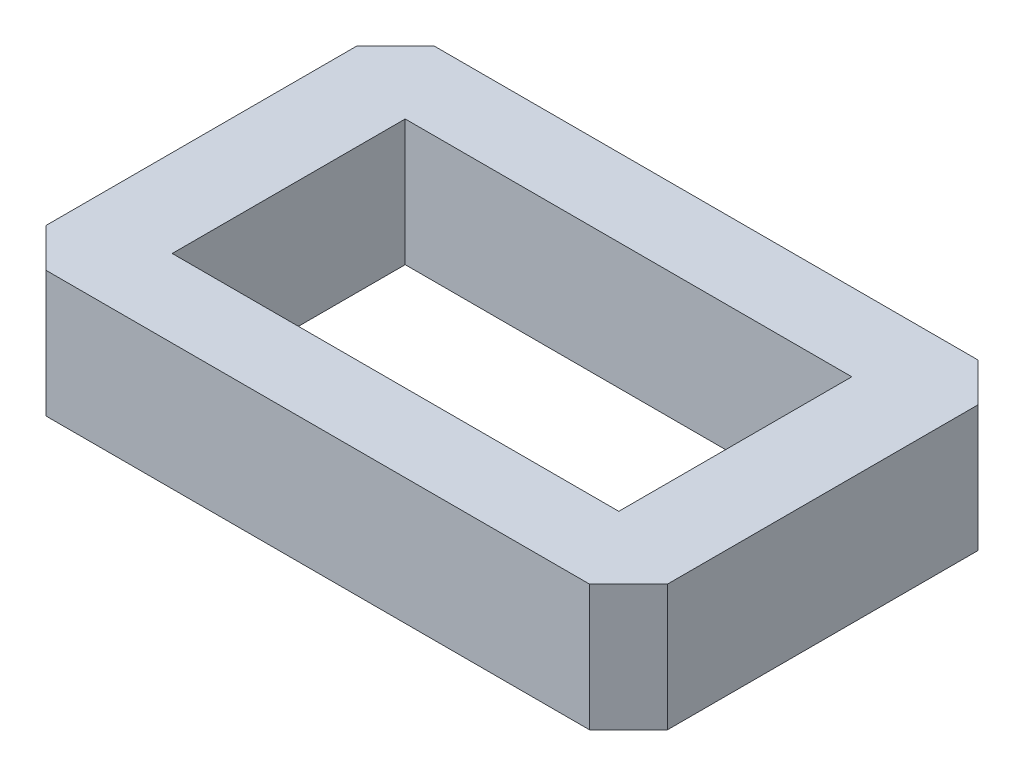
ISO-10303-21;
HEADER;
FILE_DESCRIPTION(('STEP AP214'),'2;1');
FILE_NAME('part.step','',(''),(''),'','','');
FILE_SCHEMA(('AUTOMOTIVE_DESIGN { 1 0 10303 214 1 1 1 1 }'));
ENDSEC;
DATA;
#1=APPLICATION_CONTEXT('core data for automotive mechanical design processes');
#2=APPLICATION_PROTOCOL_DEFINITION('international standard','automotive_design',2000,#1);
#3=PRODUCT_CONTEXT('',#1,'mechanical');
#4=PRODUCT('Part','Part','',(#3));
#5=PRODUCT_RELATED_PRODUCT_CATEGORY('part','',(#4));
#6=PRODUCT_DEFINITION_FORMATION('','',#4);
#7=PRODUCT_DEFINITION_CONTEXT('part definition',#1,'design');
#8=PRODUCT_DEFINITION('design','',#6,#7);
#9=PRODUCT_DEFINITION_SHAPE('','',#8);
#10=(LENGTH_UNIT() NAMED_UNIT(*) SI_UNIT(.MILLI.,.METRE.));
#11=(NAMED_UNIT(*) PLANE_ANGLE_UNIT() SI_UNIT($,.RADIAN.));
#12=(NAMED_UNIT(*) SI_UNIT($,.STERADIAN.) SOLID_ANGLE_UNIT());
#13=UNCERTAINTY_MEASURE_WITH_UNIT(LENGTH_MEASURE(1.E-05),#10,'distance_accuracy_value','');
#14=(GEOMETRIC_REPRESENTATION_CONTEXT(3) GLOBAL_UNCERTAINTY_ASSIGNED_CONTEXT((#13)) GLOBAL_UNIT_ASSIGNED_CONTEXT((#10,
#11,#12)) REPRESENTATION_CONTEXT('',''));
#15=CARTESIAN_POINT('',(0.,0.,0.));
#16=DIRECTION('',(0.,0.,1.));
#17=DIRECTION('',(1.,0.,0.));
#18=AXIS2_PLACEMENT_3D('',#15,#16,#17);
#19=CARTESIAN_POINT('',(0.,6.5,0.));
#20=DIRECTION('',(1.,0.,0.));
#21=DIRECTION('',(0.,0.,-1.));
#22=AXIS2_PLACEMENT_3D('',#19,#20,#21);
#23=PLANE('',#22);
#24=DIRECTION('',(0.,0.,1.));
#25=VECTOR('',#24,1.);
#26=CARTESIAN_POINT('',(0.,0.,0.));
#27=LINE('',#26,#25);
#28=CARTESIAN_POINT('',(0.,0.,-18.));
#29=VERTEX_POINT('',#28);
#30=CARTESIAN_POINT('',(0.,0.,-2.));
#31=VERTEX_POINT('',#30);
#32=EDGE_CURVE('E166',#29,#31,#27,.T.);
#33=ORIENTED_EDGE('',*,*,#32,.T.);
#34=DIRECTION('',(0.,1.,0.));
#35=VECTOR('',#34,1.);
#36=CARTESIAN_POINT('',(0.,6.5,-2.));
#37=LINE('',#36,#35);
#38=CARTESIAN_POINT('',(0.,6.5,-2.));
#39=VERTEX_POINT('',#38);
#40=EDGE_CURVE('E206',#31,#39,#37,.T.);
#41=ORIENTED_EDGE('',*,*,#40,.T.);
#42=DIRECTION('',(0.,0.,1.));
#43=VECTOR('',#42,1.);
#44=CARTESIAN_POINT('',(0.,6.5,0.));
#45=LINE('',#44,#43);
#46=CARTESIAN_POINT('',(0.,6.5,-18.));
#47=VERTEX_POINT('',#46);
#48=EDGE_CURVE('E170',#47,#39,#45,.T.);
#49=ORIENTED_EDGE('',*,*,#48,.F.);
#50=DIRECTION('',(0.,-1.,0.));
#51=VECTOR('',#50,1.);
#52=CARTESIAN_POINT('',(0.,6.5,-18.));
#53=LINE('',#52,#51);
#54=EDGE_CURVE('E203',#47,#29,#53,.T.);
#55=ORIENTED_EDGE('',*,*,#54,.T.);
#56=EDGE_LOOP('',(#33,#41,#49,#55));
#57=FACE_BOUND('',#56,.T.);
#58=ADVANCED_FACE('F35',(#57),#23,.F.);
#59=CARTESIAN_POINT('',(0.,6.5,0.));
#60=DIRECTION('',(0.,0.,-1.));
#61=DIRECTION('',(-1.,0.,0.));
#62=AXIS2_PLACEMENT_3D('',#59,#60,#61);
#63=PLANE('',#62);
#64=DIRECTION('',(1.,0.,0.));
#65=VECTOR('',#64,1.);
#66=CARTESIAN_POINT('',(0.,6.5,0.));
#67=LINE('',#66,#65);
#68=CARTESIAN_POINT('',(2.,6.5,0.));
#69=VERTEX_POINT('',#68);
#70=CARTESIAN_POINT('',(30.,6.5,0.));
#71=VERTEX_POINT('',#70);
#72=EDGE_CURVE('E173',#69,#71,#67,.T.);
#73=ORIENTED_EDGE('',*,*,#72,.F.);
#74=DIRECTION('',(0.,-1.,0.));
#75=VECTOR('',#74,1.);
#76=CARTESIAN_POINT('',(2.,6.5,0.));
#77=LINE('',#76,#75);
#78=CARTESIAN_POINT('',(2.,0.,0.));
#79=VERTEX_POINT('',#78);
#80=EDGE_CURVE('E192',#69,#79,#77,.T.);
#81=ORIENTED_EDGE('',*,*,#80,.T.);
#82=DIRECTION('',(1.,0.,0.));
#83=VECTOR('',#82,1.);
#84=CARTESIAN_POINT('',(0.,0.,0.));
#85=LINE('',#84,#83);
#86=CARTESIAN_POINT('',(30.,0.,0.));
#87=VERTEX_POINT('',#86);
#88=EDGE_CURVE('E184',#79,#87,#85,.T.);
#89=ORIENTED_EDGE('',*,*,#88,.T.);
#90=DIRECTION('',(0.,1.,0.));
#91=VECTOR('',#90,1.);
#92=CARTESIAN_POINT('',(30.,6.5,0.));
#93=LINE('',#92,#91);
#94=EDGE_CURVE('E181',#87,#71,#93,.T.);
#95=ORIENTED_EDGE('',*,*,#94,.T.);
#96=EDGE_LOOP('',(#73,#81,#89,#95));
#97=FACE_BOUND('',#96,.T.);
#98=ADVANCED_FACE('F248',(#97),#63,.F.);
#99=CARTESIAN_POINT('',(32.,6.5,0.));
#100=DIRECTION('',(-1.,0.,0.));
#101=DIRECTION('',(0.,0.,1.));
#102=AXIS2_PLACEMENT_3D('',#99,#100,#101);
#103=PLANE('',#102);
#104=DIRECTION('',(0.,0.,-1.));
#105=VECTOR('',#104,1.);
#106=CARTESIAN_POINT('',(32.,0.,0.));
#107=LINE('',#106,#105);
#108=CARTESIAN_POINT('',(32.,0.,-2.));
#109=VERTEX_POINT('',#108);
#110=CARTESIAN_POINT('',(32.,0.,-18.));
#111=VERTEX_POINT('',#110);
#112=EDGE_CURVE('E187',#109,#111,#107,.T.);
#113=ORIENTED_EDGE('',*,*,#112,.T.);
#114=DIRECTION('',(0.,1.,0.));
#115=VECTOR('',#114,1.);
#116=CARTESIAN_POINT('',(32.,6.5,-18.));
#117=LINE('',#116,#115);
#118=CARTESIAN_POINT('',(32.,6.5,-18.));
#119=VERTEX_POINT('',#118);
#120=EDGE_CURVE('E11',#111,#119,#117,.T.);
#121=ORIENTED_EDGE('',*,*,#120,.T.);
#122=DIRECTION('',(0.,0.,-1.));
#123=VECTOR('',#122,1.);
#124=CARTESIAN_POINT('',(32.,6.5,0.));
#125=LINE('',#124,#123);
#126=CARTESIAN_POINT('',(32.,6.5,-2.));
#127=VERTEX_POINT('',#126);
#128=EDGE_CURVE('E177',#127,#119,#125,.T.);
#129=ORIENTED_EDGE('',*,*,#128,.F.);
#130=DIRECTION('',(0.,-1.,0.));
#131=VECTOR('',#130,1.);
#132=CARTESIAN_POINT('',(32.,6.5,-2.));
#133=LINE('',#132,#131);
#134=EDGE_CURVE('E44',#127,#109,#133,.T.);
#135=ORIENTED_EDGE('',*,*,#134,.T.);
#136=EDGE_LOOP('',(#113,#121,#129,#135));
#137=FACE_BOUND('',#136,.T.);
#138=ADVANCED_FACE('F223',(#137),#103,.F.);
#139=CARTESIAN_POINT('',(0.,6.5,-20.));
#140=DIRECTION('',(0.,0.,1.));
#141=DIRECTION('',(1.,0.,0.));
#142=AXIS2_PLACEMENT_3D('',#139,#140,#141);
#143=PLANE('',#142);
#144=DIRECTION('',(-1.,0.,0.));
#145=VECTOR('',#144,1.);
#146=CARTESIAN_POINT('',(0.,0.,-20.));
#147=LINE('',#146,#145);
#148=CARTESIAN_POINT('',(30.,0.,-20.));
#149=VERTEX_POINT('',#148);
#150=CARTESIAN_POINT('',(2.,0.,-20.));
#151=VERTEX_POINT('',#150);
#152=EDGE_CURVE('E174',#149,#151,#147,.T.);
#153=ORIENTED_EDGE('',*,*,#152,.T.);
#154=DIRECTION('',(0.,1.,0.));
#155=VECTOR('',#154,1.);
#156=CARTESIAN_POINT('',(2.,6.5,-20.));
#157=LINE('',#156,#155);
#158=CARTESIAN_POINT('',(2.,6.5,-20.));
#159=VERTEX_POINT('',#158);
#160=EDGE_CURVE('E51',#151,#159,#157,.T.);
#161=ORIENTED_EDGE('',*,*,#160,.T.);
#162=DIRECTION('',(-1.,0.,0.));
#163=VECTOR('',#162,1.);
#164=CARTESIAN_POINT('',(0.,6.5,-20.));
#165=LINE('',#164,#163);
#166=CARTESIAN_POINT('',(30.,6.5,-20.));
#167=VERTEX_POINT('',#166);
#168=EDGE_CURVE('E179',#167,#159,#165,.T.);
#169=ORIENTED_EDGE('',*,*,#168,.F.);
#170=DIRECTION('',(0.,-1.,0.));
#171=VECTOR('',#170,1.);
#172=CARTESIAN_POINT('',(30.,6.5,-20.));
#173=LINE('',#172,#171);
#174=EDGE_CURVE('E215',#167,#149,#173,.T.);
#175=ORIENTED_EDGE('',*,*,#174,.T.);
#176=EDGE_LOOP('',(#153,#161,#169,#175));
#177=FACE_BOUND('',#176,.T.);
#178=ADVANCED_FACE('F232',(#177),#143,.F.);
#179=CARTESIAN_POINT('',(0.,6.5,0.));
#180=DIRECTION('',(0.,-1.,0.));
#181=DIRECTION('',(0.,0.,-1.));
#182=AXIS2_PLACEMENT_3D('',#179,#180,#181);
#183=PLANE('',#182);
#184=DIRECTION('',(-1.,0.,0.));
#185=VECTOR('',#184,1.);
#186=CARTESIAN_POINT('',(4.5,6.5,-16.));
#187=LINE('',#186,#185);
#188=CARTESIAN_POINT('',(27.5,6.5,-16.));
#189=VERTEX_POINT('',#188);
#190=CARTESIAN_POINT('',(4.5,6.5,-16.));
#191=VERTEX_POINT('',#190);
#192=EDGE_CURVE('E160',#189,#191,#187,.T.);
#193=ORIENTED_EDGE('',*,*,#192,.F.);
#194=DIRECTION('',(0.,0.,-1.));
#195=VECTOR('',#194,1.);
#196=CARTESIAN_POINT('',(27.5,6.5,-4.));
#197=LINE('',#196,#195);
#198=CARTESIAN_POINT('',(27.5,6.5,-4.));
#199=VERTEX_POINT('',#198);
#200=EDGE_CURVE('E133',#199,#189,#197,.T.);
#201=ORIENTED_EDGE('',*,*,#200,.F.);
#202=DIRECTION('',(1.,0.,0.));
#203=VECTOR('',#202,1.);
#204=CARTESIAN_POINT('',(4.5,6.5,-4.));
#205=LINE('',#204,#203);
#206=CARTESIAN_POINT('',(4.5,6.5,-4.));
#207=VERTEX_POINT('',#206);
#208=EDGE_CURVE('E151',#207,#199,#205,.T.);
#209=ORIENTED_EDGE('',*,*,#208,.F.);
#210=DIRECTION('',(0.,0.,1.));
#211=VECTOR('',#210,1.);
#212=CARTESIAN_POINT('',(4.5,6.5,-4.));
#213=LINE('',#212,#211);
#214=EDGE_CURVE('E154',#191,#207,#213,.T.);
#215=ORIENTED_EDGE('',*,*,#214,.F.);
#216=EDGE_LOOP('',(#193,#201,#209,#215));
#217=FACE_BOUND('',#216,.T.);
#218=ORIENTED_EDGE('',*,*,#48,.T.);
#219=DIRECTION('',(-0.707106781186546,0.,-0.707106781186549));
#220=VECTOR('',#219,1.);
#221=CARTESIAN_POINT('',(2.,6.5,0.));
#222=LINE('',#221,#220);
#223=EDGE_CURVE('E213',#39,#69,#222,.F.);
#224=ORIENTED_EDGE('',*,*,#223,.T.);
#225=ORIENTED_EDGE('',*,*,#72,.T.);
#226=DIRECTION('',(-0.707106781186549,0.,0.707106781186546));
#227=VECTOR('',#226,1.);
#228=CARTESIAN_POINT('',(32.,6.5,-2.));
#229=LINE('',#228,#227);
#230=EDGE_CURVE('E208',#71,#127,#229,.F.);
#231=ORIENTED_EDGE('',*,*,#230,.T.);
#232=ORIENTED_EDGE('',*,*,#128,.T.);
#233=DIRECTION('',(0.707106781186546,0.,0.707106781186549));
#234=VECTOR('',#233,1.);
#235=CARTESIAN_POINT('',(30.,6.5,-20.));
#236=LINE('',#235,#234);
#237=EDGE_CURVE('E58',#119,#167,#236,.F.);
#238=ORIENTED_EDGE('',*,*,#237,.T.);
#239=ORIENTED_EDGE('',*,*,#168,.T.);
#240=DIRECTION('',(0.707106781186548,0.,-0.707106781186547));
#241=VECTOR('',#240,1.);
#242=CARTESIAN_POINT('',(0.,6.5,-18.));
#243=LINE('',#242,#241);
#244=EDGE_CURVE('E211',#159,#47,#243,.F.);
#245=ORIENTED_EDGE('',*,*,#244,.T.);
#246=EDGE_LOOP('',(#218,#224,#225,#231,#232,#238,#239,#245));
#247=FACE_BOUND('',#246,.T.);
#248=ADVANCED_FACE('F234',(#217,#247),#183,.F.);
#249=CARTESIAN_POINT('',(0.,0.,0.));
#250=DIRECTION('',(0.,-1.,0.));
#251=DIRECTION('',(0.,0.,-1.));
#252=AXIS2_PLACEMENT_3D('',#249,#250,#251);
#253=PLANE('',#252);
#254=DIRECTION('',(0.,0.,-1.));
#255=VECTOR('',#254,1.);
#256=CARTESIAN_POINT('',(27.5,0.,-4.));
#257=LINE('',#256,#255);
#258=CARTESIAN_POINT('',(27.5,0.,-4.));
#259=VERTEX_POINT('',#258);
#260=CARTESIAN_POINT('',(27.5,0.,-16.));
#261=VERTEX_POINT('',#260);
#262=EDGE_CURVE('E130',#259,#261,#257,.T.);
#263=ORIENTED_EDGE('',*,*,#262,.T.);
#264=DIRECTION('',(-1.,0.,0.));
#265=VECTOR('',#264,1.);
#266=CARTESIAN_POINT('',(4.5,0.,-16.));
#267=LINE('',#266,#265);
#268=CARTESIAN_POINT('',(4.5,0.,-16.));
#269=VERTEX_POINT('',#268);
#270=EDGE_CURVE('E142',#261,#269,#267,.T.);
#271=ORIENTED_EDGE('',*,*,#270,.T.);
#272=DIRECTION('',(0.,0.,1.));
#273=VECTOR('',#272,1.);
#274=CARTESIAN_POINT('',(4.5,0.,-4.));
#275=LINE('',#274,#273);
#276=CARTESIAN_POINT('',(4.5,0.,-4.));
#277=VERTEX_POINT('',#276);
#278=EDGE_CURVE('E146',#269,#277,#275,.T.);
#279=ORIENTED_EDGE('',*,*,#278,.T.);
#280=DIRECTION('',(1.,0.,0.));
#281=VECTOR('',#280,1.);
#282=CARTESIAN_POINT('',(4.5,0.,-4.));
#283=LINE('',#282,#281);
#284=EDGE_CURVE('E138',#277,#259,#283,.T.);
#285=ORIENTED_EDGE('',*,*,#284,.T.);
#286=EDGE_LOOP('',(#263,#271,#279,#285));
#287=FACE_BOUND('',#286,.T.);
#288=ORIENTED_EDGE('',*,*,#88,.F.);
#289=DIRECTION('',(0.707106781186546,0.,0.707106781186549));
#290=VECTOR('',#289,1.);
#291=CARTESIAN_POINT('',(1.,0.,-0.999999999999998));
#292=LINE('',#291,#290);
#293=EDGE_CURVE('E201',#79,#31,#292,.F.);
#294=ORIENTED_EDGE('',*,*,#293,.T.);
#295=ORIENTED_EDGE('',*,*,#32,.F.);
#296=DIRECTION('',(-0.707106781186548,0.,0.707106781186547));
#297=VECTOR('',#296,1.);
#298=CARTESIAN_POINT('',(-9.,0.,-9.00000000000001));
#299=LINE('',#298,#297);
#300=EDGE_CURVE('E199',#29,#151,#299,.F.);
#301=ORIENTED_EDGE('',*,*,#300,.T.);
#302=ORIENTED_EDGE('',*,*,#152,.F.);
#303=DIRECTION('',(-0.707106781186546,0.,-0.707106781186549));
#304=VECTOR('',#303,1.);
#305=CARTESIAN_POINT('',(25.0000000000001,0.,-25.));
#306=LINE('',#305,#304);
#307=EDGE_CURVE('E197',#149,#111,#306,.F.);
#308=ORIENTED_EDGE('',*,*,#307,.T.);
#309=ORIENTED_EDGE('',*,*,#112,.F.);
#310=DIRECTION('',(0.707106781186549,0.,-0.707106781186546));
#311=VECTOR('',#310,1.);
#312=CARTESIAN_POINT('',(14.9999999999999,0.,15.));
#313=LINE('',#312,#311);
#314=EDGE_CURVE('E195',#109,#87,#313,.F.);
#315=ORIENTED_EDGE('',*,*,#314,.T.);
#316=EDGE_LOOP('',(#288,#294,#295,#301,#302,#308,#309,#315));
#317=FACE_BOUND('',#316,.T.);
#318=ADVANCED_FACE('F148',(#287,#317),#253,.T.);
#319=CARTESIAN_POINT('',(27.5,0.,-4.));
#320=DIRECTION('',(1.,0.,0.));
#321=DIRECTION('',(0.,0.,-1.));
#322=AXIS2_PLACEMENT_3D('',#319,#320,#321);
#323=PLANE('',#322);
#324=ORIENTED_EDGE('',*,*,#200,.T.);
#325=DIRECTION('',(0.,1.,0.));
#326=VECTOR('',#325,1.);
#327=CARTESIAN_POINT('',(27.5,0.,-16.));
#328=LINE('',#327,#326);
#329=EDGE_CURVE('E126',#261,#189,#328,.T.);
#330=ORIENTED_EDGE('',*,*,#329,.F.);
#331=ORIENTED_EDGE('',*,*,#262,.F.);
#332=DIRECTION('',(0.,1.,0.));
#333=VECTOR('',#332,1.);
#334=CARTESIAN_POINT('',(27.5,0.,-4.));
#335=LINE('',#334,#333);
#336=EDGE_CURVE('E164',#259,#199,#335,.T.);
#337=ORIENTED_EDGE('',*,*,#336,.T.);
#338=EDGE_LOOP('',(#324,#330,#331,#337));
#339=FACE_BOUND('',#338,.T.);
#340=ADVANCED_FACE('F128',(#339),#323,.F.);
#341=CARTESIAN_POINT('',(4.5,0.,-4.));
#342=DIRECTION('',(0.,0.,1.));
#343=DIRECTION('',(1.,0.,0.));
#344=AXIS2_PLACEMENT_3D('',#341,#342,#343);
#345=PLANE('',#344);
#346=ORIENTED_EDGE('',*,*,#208,.T.);
#347=ORIENTED_EDGE('',*,*,#336,.F.);
#348=ORIENTED_EDGE('',*,*,#284,.F.);
#349=DIRECTION('',(0.,1.,0.));
#350=VECTOR('',#349,1.);
#351=CARTESIAN_POINT('',(4.5,0.,-4.));
#352=LINE('',#351,#350);
#353=EDGE_CURVE('E167',#277,#207,#352,.T.);
#354=ORIENTED_EDGE('',*,*,#353,.T.);
#355=EDGE_LOOP('',(#346,#347,#348,#354));
#356=FACE_BOUND('',#355,.T.);
#357=ADVANCED_FACE('F313',(#356),#345,.F.);
#358=CARTESIAN_POINT('',(4.5,0.,-4.));
#359=DIRECTION('',(-1.,0.,0.));
#360=DIRECTION('',(0.,0.,1.));
#361=AXIS2_PLACEMENT_3D('',#358,#359,#360);
#362=PLANE('',#361);
#363=ORIENTED_EDGE('',*,*,#214,.T.);
#364=ORIENTED_EDGE('',*,*,#353,.F.);
#365=ORIENTED_EDGE('',*,*,#278,.F.);
#366=DIRECTION('',(0.,1.,0.));
#367=VECTOR('',#366,1.);
#368=CARTESIAN_POINT('',(4.5,0.,-16.));
#369=LINE('',#368,#367);
#370=EDGE_CURVE('E137',#269,#191,#369,.T.);
#371=ORIENTED_EDGE('',*,*,#370,.T.);
#372=EDGE_LOOP('',(#363,#364,#365,#371));
#373=FACE_BOUND('',#372,.T.);
#374=ADVANCED_FACE('F305',(#373),#362,.F.);
#375=CARTESIAN_POINT('',(4.5,0.,-16.));
#376=DIRECTION('',(0.,0.,-1.));
#377=DIRECTION('',(-1.,0.,0.));
#378=AXIS2_PLACEMENT_3D('',#375,#376,#377);
#379=PLANE('',#378);
#380=ORIENTED_EDGE('',*,*,#192,.T.);
#381=ORIENTED_EDGE('',*,*,#370,.F.);
#382=ORIENTED_EDGE('',*,*,#270,.F.);
#383=ORIENTED_EDGE('',*,*,#329,.T.);
#384=EDGE_LOOP('',(#380,#381,#382,#383));
#385=FACE_BOUND('',#384,.T.);
#386=ADVANCED_FACE('F143',(#385),#379,.F.);
#387=CARTESIAN_POINT('',(2.,6.5,0.));
#388=DIRECTION('',(0.707106781186549,0.,-0.707106781186546));
#389=DIRECTION('',(0.,-1.,0.));
#390=AXIS2_PLACEMENT_3D('',#387,#388,#389);
#391=PLANE('',#390);
#392=ORIENTED_EDGE('',*,*,#223,.F.);
#393=ORIENTED_EDGE('',*,*,#40,.F.);
#394=ORIENTED_EDGE('',*,*,#293,.F.);
#395=ORIENTED_EDGE('',*,*,#80,.F.);
#396=EDGE_LOOP('',(#392,#393,#394,#395));
#397=FACE_BOUND('',#396,.T.);
#398=ADVANCED_FACE('F245',(#397),#391,.F.);
#399=CARTESIAN_POINT('',(0.,6.5,-18.));
#400=DIRECTION('',(0.707106781186547,0.,0.707106781186548));
#401=DIRECTION('',(0.,-1.,0.));
#402=AXIS2_PLACEMENT_3D('',#399,#400,#401);
#403=PLANE('',#402);
#404=ORIENTED_EDGE('',*,*,#244,.F.);
#405=ORIENTED_EDGE('',*,*,#160,.F.);
#406=ORIENTED_EDGE('',*,*,#300,.F.);
#407=ORIENTED_EDGE('',*,*,#54,.F.);
#408=EDGE_LOOP('',(#404,#405,#406,#407));
#409=FACE_BOUND('',#408,.T.);
#410=ADVANCED_FACE('F238',(#409),#403,.F.);
#411=CARTESIAN_POINT('',(30.,6.5,-20.));
#412=DIRECTION('',(-0.707106781186549,0.,0.707106781186546));
#413=DIRECTION('',(0.,-1.,0.));
#414=AXIS2_PLACEMENT_3D('',#411,#412,#413);
#415=PLANE('',#414);
#416=ORIENTED_EDGE('',*,*,#237,.F.);
#417=ORIENTED_EDGE('',*,*,#120,.F.);
#418=ORIENTED_EDGE('',*,*,#307,.F.);
#419=ORIENTED_EDGE('',*,*,#174,.F.);
#420=EDGE_LOOP('',(#416,#417,#418,#419));
#421=FACE_BOUND('',#420,.T.);
#422=ADVANCED_FACE('F231',(#421),#415,.F.);
#423=CARTESIAN_POINT('',(32.,6.5,-2.));
#424=DIRECTION('',(-0.707106781186546,0.,-0.707106781186549));
#425=DIRECTION('',(0.,-1.,0.));
#426=AXIS2_PLACEMENT_3D('',#423,#424,#425);
#427=PLANE('',#426);
#428=ORIENTED_EDGE('',*,*,#230,.F.);
#429=ORIENTED_EDGE('',*,*,#94,.F.);
#430=ORIENTED_EDGE('',*,*,#314,.F.);
#431=ORIENTED_EDGE('',*,*,#134,.F.);
#432=EDGE_LOOP('',(#428,#429,#430,#431));
#433=FACE_BOUND('',#432,.T.);
#434=ADVANCED_FACE('F38',(#433),#427,.F.);
#435=CLOSED_SHELL('',(#58,#98,#138,#178,#248,#318,#340,#357,#374,#386,#398,#410,#422,#434));
#436=MANIFOLD_SOLID_BREP('B2',#435);
#437=ADVANCED_BREP_SHAPE_REPRESENTATION('',(#18,#436),#14);
#438=SHAPE_DEFINITION_REPRESENTATION(#9,#437);
ENDSEC;
END-ISO-10303-21;
